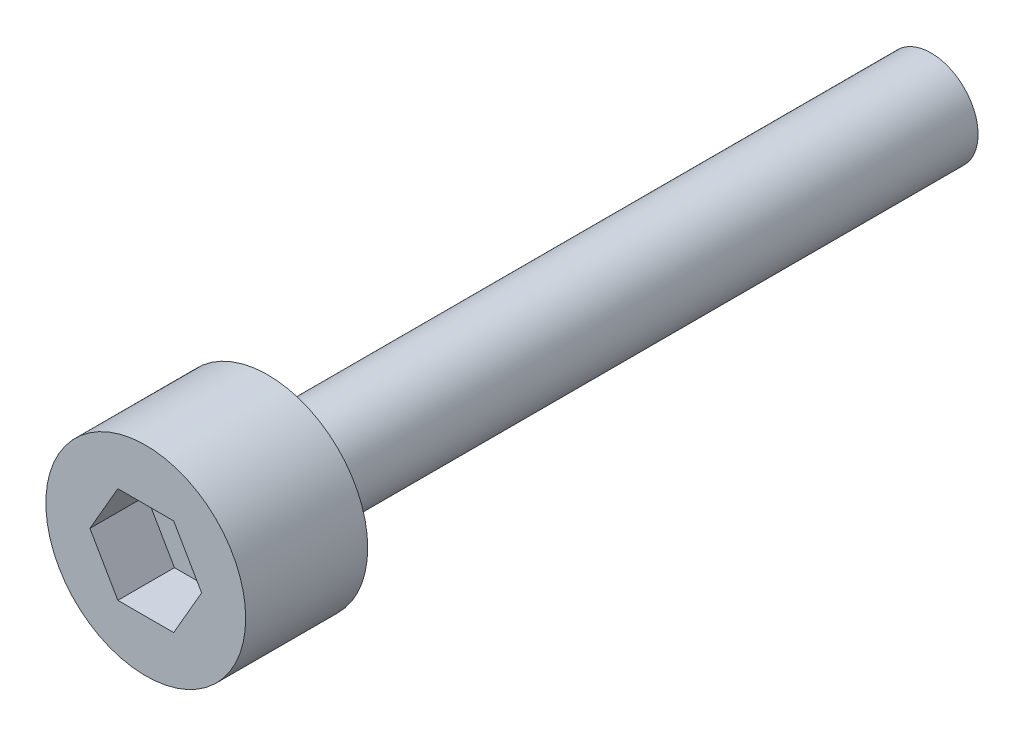
ISO-10303-21;
HEADER;
FILE_DESCRIPTION(('STEP AP214'),'2;1');
FILE_NAME('part.step','',(''),(''),'','','');
FILE_SCHEMA(('AUTOMOTIVE_DESIGN { 1 0 10303 214 1 1 1 1 }'));
ENDSEC;
DATA;
#1=APPLICATION_CONTEXT('core data for automotive mechanical design processes');
#2=APPLICATION_PROTOCOL_DEFINITION('international standard','automotive_design',2000,#1);
#3=PRODUCT_CONTEXT('',#1,'mechanical');
#4=PRODUCT('Part','Part','',(#3));
#5=PRODUCT_RELATED_PRODUCT_CATEGORY('part','',(#4));
#6=PRODUCT_DEFINITION_FORMATION('','',#4);
#7=PRODUCT_DEFINITION_CONTEXT('part definition',#1,'design');
#8=PRODUCT_DEFINITION('design','',#6,#7);
#9=PRODUCT_DEFINITION_SHAPE('','',#8);
#10=(LENGTH_UNIT() NAMED_UNIT(*) SI_UNIT(.MILLI.,.METRE.));
#11=(NAMED_UNIT(*) PLANE_ANGLE_UNIT() SI_UNIT($,.RADIAN.));
#12=(NAMED_UNIT(*) SI_UNIT($,.STERADIAN.) SOLID_ANGLE_UNIT());
#13=UNCERTAINTY_MEASURE_WITH_UNIT(LENGTH_MEASURE(1.E-05),#10,'distance_accuracy_value','');
#14=(GEOMETRIC_REPRESENTATION_CONTEXT(3) GLOBAL_UNCERTAINTY_ASSIGNED_CONTEXT((#13)) GLOBAL_UNIT_ASSIGNED_CONTEXT((#10,
#11,#12)) REPRESENTATION_CONTEXT('',''));
#15=CARTESIAN_POINT('',(0.,0.,0.));
#16=DIRECTION('',(0.,0.,1.));
#17=DIRECTION('',(1.,0.,0.));
#18=AXIS2_PLACEMENT_3D('',#15,#16,#17);
#19=CARTESIAN_POINT('',(0.,0.,3.5052));
#20=DIRECTION('',(0.,0.,-1.));
#21=DIRECTION('',(-1.,0.,0.));
#22=AXIS2_PLACEMENT_3D('',#19,#20,#21);
#23=CYLINDRICAL_SURFACE('',#22,2.8702);
#24=CARTESIAN_POINT('',(0.,0.,3.5052));
#25=DIRECTION('',(0.,0.,1.));
#26=DIRECTION('',(1.,0.,0.));
#27=AXIS2_PLACEMENT_3D('',#24,#25,#26);
#28=CIRCLE('',#27,2.8702);
#29=CARTESIAN_POINT('',(2.8702,0.,3.5052));
#30=VERTEX_POINT('',#29);
#31=EDGE_CURVE('E12',#30,#30,#28,.T.);
#32=ORIENTED_EDGE('',*,*,#31,.F.);
#33=EDGE_LOOP('',(#32));
#34=FACE_BOUND('',#33,.T.);
#35=CARTESIAN_POINT('',(0.,0.,0.));
#36=DIRECTION('',(0.,0.,1.));
#37=DIRECTION('',(1.,0.,0.));
#38=AXIS2_PLACEMENT_3D('',#35,#36,#37);
#39=CIRCLE('',#38,2.8702);
#40=CARTESIAN_POINT('',(2.8702,0.,0.));
#41=VERTEX_POINT('',#40);
#42=EDGE_CURVE('E37',#41,#41,#39,.T.);
#43=ORIENTED_EDGE('',*,*,#42,.T.);
#44=EDGE_LOOP('',(#43));
#45=FACE_BOUND('',#44,.T.);
#46=ADVANCED_FACE('F34',(#34,#45),#23,.T.);
#47=CARTESIAN_POINT('',(0.,0.,3.5052));
#48=DIRECTION('',(0.,0.,1.));
#49=DIRECTION('',(1.,0.,0.));
#50=AXIS2_PLACEMENT_3D('',#47,#48,#49);
#51=PLANE('',#50);
#52=DIRECTION('',(-0.5,0.866025403784438,0.));
#53=VECTOR('',#52,1.);
#54=CARTESIAN_POINT('',(1.60395121659243,0.,3.5052));
#55=LINE('',#54,#53);
#56=CARTESIAN_POINT('',(1.60395121659243,0.,3.5052));
#57=VERTEX_POINT('',#56);
#58=CARTESIAN_POINT('',(0.801975608296214,1.3890625,3.5052));
#59=VERTEX_POINT('',#58);
#60=EDGE_CURVE('E48',#57,#59,#55,.T.);
#61=ORIENTED_EDGE('',*,*,#60,.F.);
#62=DIRECTION('',(0.5,0.866025403784439,0.));
#63=VECTOR('',#62,1.);
#64=CARTESIAN_POINT('',(0.801975608296215,-1.3890625,3.5052));
#65=LINE('',#64,#63);
#66=CARTESIAN_POINT('',(0.801975608296215,-1.3890625,3.5052));
#67=VERTEX_POINT('',#66);
#68=EDGE_CURVE('E131',#67,#57,#65,.T.);
#69=ORIENTED_EDGE('',*,*,#68,.F.);
#70=DIRECTION('',(1.,0.,0.));
#71=VECTOR('',#70,1.);
#72=CARTESIAN_POINT('',(-0.801975608296214,-1.3890625,3.5052));
#73=LINE('',#72,#71);
#74=CARTESIAN_POINT('',(-0.801975608296214,-1.3890625,3.5052));
#75=VERTEX_POINT('',#74);
#76=EDGE_CURVE('E129',#75,#67,#73,.T.);
#77=ORIENTED_EDGE('',*,*,#76,.F.);
#78=DIRECTION('',(0.5,-0.866025403784439,0.));
#79=VECTOR('',#78,1.);
#80=CARTESIAN_POINT('',(-1.60395121659243,0.,3.5052));
#81=LINE('',#80,#79);
#82=CARTESIAN_POINT('',(-1.60395121659243,0.,3.5052));
#83=VERTEX_POINT('',#82);
#84=EDGE_CURVE('E96',#83,#75,#81,.T.);
#85=ORIENTED_EDGE('',*,*,#84,.F.);
#86=DIRECTION('',(-0.499999999999999,-0.866025403784439,0.));
#87=VECTOR('',#86,1.);
#88=CARTESIAN_POINT('',(-0.801975608296215,1.3890625,3.5052));
#89=LINE('',#88,#87);
#90=CARTESIAN_POINT('',(-0.801975608296215,1.3890625,3.5052));
#91=VERTEX_POINT('',#90);
#92=EDGE_CURVE('E125',#91,#83,#89,.T.);
#93=ORIENTED_EDGE('',*,*,#92,.F.);
#94=DIRECTION('',(-1.,0.,0.));
#95=VECTOR('',#94,1.);
#96=CARTESIAN_POINT('',(0.801975608296214,1.3890625,3.5052));
#97=LINE('',#96,#95);
#98=EDGE_CURVE('E122',#59,#91,#97,.T.);
#99=ORIENTED_EDGE('',*,*,#98,.F.);
#100=EDGE_LOOP('',(#61,#69,#77,#85,#93,#99));
#101=FACE_BOUND('',#100,.T.);
#102=ORIENTED_EDGE('',*,*,#31,.T.);
#103=EDGE_LOOP('',(#102));
#104=FACE_BOUND('',#103,.T.);
#105=ADVANCED_FACE('F160',(#101,#104),#51,.T.);
#106=CARTESIAN_POINT('',(0.,0.,0.));
#107=DIRECTION('',(0.,0.,1.));
#108=DIRECTION('',(1.,0.,0.));
#109=AXIS2_PLACEMENT_3D('',#106,#107,#108);
#110=PLANE('',#109);
#111=ORIENTED_EDGE('',*,*,#42,.F.);
#112=EDGE_LOOP('',(#111));
#113=FACE_BOUND('',#112,.T.);
#114=CARTESIAN_POINT('',(0.,0.,0.));
#115=DIRECTION('',(0.,0.,-1.));
#116=DIRECTION('',(-1.,0.,0.));
#117=AXIS2_PLACEMENT_3D('',#114,#115,#116);
#118=CIRCLE('',#117,1.35255);
#119=CARTESIAN_POINT('',(-1.35255,0.,0.));
#120=VERTEX_POINT('',#119);
#121=EDGE_CURVE('E141',#120,#120,#118,.T.);
#122=ORIENTED_EDGE('',*,*,#121,.F.);
#123=EDGE_LOOP('',(#122));
#124=FACE_BOUND('',#123,.T.);
#125=ADVANCED_FACE('F151',(#113,#124),#110,.F.);
#126=CARTESIAN_POINT('',(0.,0.,0.));
#127=DIRECTION('',(0.,0.,-1.));
#128=DIRECTION('',(-1.,0.,0.));
#129=AXIS2_PLACEMENT_3D('',#126,#127,#128);
#130=CYLINDRICAL_SURFACE('',#129,1.35255);
#131=CARTESIAN_POINT('',(0.,0.,-19.05));
#132=DIRECTION('',(0.,0.,-1.));
#133=DIRECTION('',(-1.,0.,0.));
#134=AXIS2_PLACEMENT_3D('',#131,#132,#133);
#135=CIRCLE('',#134,1.35255);
#136=CARTESIAN_POINT('',(-1.35255,0.,-19.05));
#137=VERTEX_POINT('',#136);
#138=EDGE_CURVE('E135',#137,#137,#135,.T.);
#139=CARTESIAN_POINT('',(-1.35255,0.,0.));
#140=CARTESIAN_POINT('',(-1.35255,0.,-0.1984375));
#141=CARTESIAN_POINT('',(-1.35255,0.,-0.396875));
#142=CARTESIAN_POINT('',(-1.35255,0.,-0.79375));
#143=CARTESIAN_POINT('',(-1.35255,0.,-0.9921875));
#144=CARTESIAN_POINT('',(-1.35255,0.,-1.3890625));
#145=CARTESIAN_POINT('',(-1.35255,0.,-1.5875));
#146=CARTESIAN_POINT('',(-1.35255,0.,-1.984375));
#147=CARTESIAN_POINT('',(-1.35255,0.,-2.1828125));
#148=CARTESIAN_POINT('',(-1.35255,0.,-2.5796875));
#149=CARTESIAN_POINT('',(-1.35255,0.,-2.778125));
#150=CARTESIAN_POINT('',(-1.35255,0.,-3.175));
#151=CARTESIAN_POINT('',(-1.35255,0.,-3.3734375));
#152=CARTESIAN_POINT('',(-1.35255,0.,-3.7703125));
#153=CARTESIAN_POINT('',(-1.35255,0.,-3.96875));
#154=CARTESIAN_POINT('',(-1.35255,0.,-4.365625));
#155=CARTESIAN_POINT('',(-1.35255,0.,-4.5640625));
#156=CARTESIAN_POINT('',(-1.35255,0.,-4.9609375));
#157=CARTESIAN_POINT('',(-1.35255,0.,-5.159375));
#158=CARTESIAN_POINT('',(-1.35255,0.,-5.55625));
#159=CARTESIAN_POINT('',(-1.35255,0.,-5.7546875));
#160=CARTESIAN_POINT('',(-1.35255,0.,-6.1515625));
#161=CARTESIAN_POINT('',(-1.35255,0.,-6.35));
#162=CARTESIAN_POINT('',(-1.35255,0.,-6.746875));
#163=CARTESIAN_POINT('',(-1.35255,0.,-6.9453125));
#164=CARTESIAN_POINT('',(-1.35255,0.,-7.3421875));
#165=CARTESIAN_POINT('',(-1.35255,0.,-7.540625));
#166=CARTESIAN_POINT('',(-1.35255,0.,-7.9375));
#167=CARTESIAN_POINT('',(-1.35255,0.,-8.1359375));
#168=CARTESIAN_POINT('',(-1.35255,0.,-8.5328125));
#169=CARTESIAN_POINT('',(-1.35255,0.,-8.73125));
#170=CARTESIAN_POINT('',(-1.35255,0.,-9.128125));
#171=CARTESIAN_POINT('',(-1.35255,0.,-9.3265625));
#172=CARTESIAN_POINT('',(-1.35255,0.,-9.7234375));
#173=CARTESIAN_POINT('',(-1.35255,0.,-9.921875));
#174=CARTESIAN_POINT('',(-1.35255,0.,-10.31875));
#175=CARTESIAN_POINT('',(-1.35255,0.,-10.5171875));
#176=CARTESIAN_POINT('',(-1.35255,0.,-10.9140625));
#177=CARTESIAN_POINT('',(-1.35255,0.,-11.1125));
#178=CARTESIAN_POINT('',(-1.35255,0.,-11.509375));
#179=CARTESIAN_POINT('',(-1.35255,0.,-11.7078125));
#180=CARTESIAN_POINT('',(-1.35255,0.,-12.1046875));
#181=CARTESIAN_POINT('',(-1.35255,0.,-12.303125));
#182=CARTESIAN_POINT('',(-1.35255,0.,-12.7));
#183=CARTESIAN_POINT('',(-1.35255,0.,-12.8984375));
#184=CARTESIAN_POINT('',(-1.35255,0.,-13.2953125));
#185=CARTESIAN_POINT('',(-1.35255,0.,-13.49375));
#186=CARTESIAN_POINT('',(-1.35255,0.,-13.890625));
#187=CARTESIAN_POINT('',(-1.35255,0.,-14.0890625));
#188=CARTESIAN_POINT('',(-1.35255,0.,-14.4859375));
#189=CARTESIAN_POINT('',(-1.35255,0.,-14.684375));
#190=CARTESIAN_POINT('',(-1.35255,0.,-15.08125));
#191=CARTESIAN_POINT('',(-1.35255,0.,-15.2796875));
#192=CARTESIAN_POINT('',(-1.35255,0.,-15.6765625));
#193=CARTESIAN_POINT('',(-1.35255,0.,-15.875));
#194=CARTESIAN_POINT('',(-1.35255,0.,-16.271875));
#195=CARTESIAN_POINT('',(-1.35255,0.,-16.4703125));
#196=CARTESIAN_POINT('',(-1.35255,0.,-16.8671875));
#197=CARTESIAN_POINT('',(-1.35255,0.,-17.065625));
#198=CARTESIAN_POINT('',(-1.35255,0.,-17.4625));
#199=CARTESIAN_POINT('',(-1.35255,0.,-17.6609375));
#200=CARTESIAN_POINT('',(-1.35255,0.,-18.0578125));
#201=CARTESIAN_POINT('',(-1.35255,0.,-18.25625));
#202=CARTESIAN_POINT('',(-1.35255,0.,-18.653125));
#203=CARTESIAN_POINT('',(-1.35255,0.,-18.8515625));
#204=CARTESIAN_POINT('',(-1.35255,0.,-19.05));
#205=B_SPLINE_CURVE_WITH_KNOTS('',3,(#139,#140,#141,#142,#143,#144,#145,#146,#147,#148,#149,
#150,#151,#152,#153,#154,#155,#156,#157,#158,#159,#160,#161,#162,#163,#164,#165,#166,#167,#168,
#169,#170,#171,#172,#173,#174,#175,#176,#177,#178,#179,#180,#181,#182,#183,#184,#185,#186,#187,
#188,#189,#190,#191,#192,#193,#194,#195,#196,#197,#198,#199,#200,#201,#202,#203,#204),
.UNSPECIFIED.,.F.,.F.,(4,2,2,2,2,2,2,2,2,2,2,2,2,2,2,2,2,2,2,2,2,2,2,2,2,2,2,2,2,2,2,2,4),(0.,
0.5953125,1.190625,1.7859375,2.38125,2.9765625,3.571875,4.1671875,4.7625,5.3578125,5.953125,
6.5484375,7.14375,7.7390625,8.334375,8.9296875,9.525,10.1203125,10.715625,11.3109375,11.90625,
12.5015625,13.096875,13.6921875,14.2875,14.8828125,15.478125,16.0734375,16.66875,17.2640625,
17.859375,18.4546875,19.05),.UNSPECIFIED.);
#206=EDGE_CURVE('BSEAM149',#120,#137,#205,.T.);
#207=ORIENTED_EDGE('',*,*,#121,.T.);
#208=ORIENTED_EDGE('',*,*,#138,.F.);
#209=ORIENTED_EDGE('',*,*,#206,.T.);
#210=ORIENTED_EDGE('',*,*,#206,.F.);
#211=EDGE_LOOP('',(#207,#209,#208,#210));
#212=FACE_BOUND('',#211,.T.);
#213=ADVANCED_FACE('F149',(#212),#130,.T.);
#214=CARTESIAN_POINT('',(0.,0.,-19.05));
#215=DIRECTION('',(0.,0.,-1.));
#216=DIRECTION('',(-1.,0.,0.));
#217=AXIS2_PLACEMENT_3D('',#214,#215,#216);
#218=PLANE('',#217);
#219=ORIENTED_EDGE('',*,*,#138,.T.);
#220=EDGE_LOOP('',(#219));
#221=FACE_BOUND('',#220,.T.);
#222=ADVANCED_FACE('F147',(#221),#218,.T.);
#223=CARTESIAN_POINT('',(1.60395121659243,0.,1.8796));
#224=DIRECTION('',(0.866025403784439,0.5,0.));
#225=DIRECTION('',(-0.5,0.866025403784439,0.));
#226=AXIS2_PLACEMENT_3D('',#223,#224,#225);
#227=PLANE('',#226);
#228=ORIENTED_EDGE('',*,*,#60,.T.);
#229=DIRECTION('',(0.,0.,1.));
#230=VECTOR('',#229,1.);
#231=CARTESIAN_POINT('',(0.801975608296214,1.3890625,1.8796));
#232=LINE('',#231,#230);
#233=CARTESIAN_POINT('',(0.801975608296214,1.3890625,1.8796));
#234=VERTEX_POINT('',#233);
#235=EDGE_CURVE('E78',#234,#59,#232,.T.);
#236=ORIENTED_EDGE('',*,*,#235,.F.);
#237=DIRECTION('',(-0.5,0.866025403784438,0.));
#238=VECTOR('',#237,1.);
#239=CARTESIAN_POINT('',(1.60395121659243,0.,1.8796));
#240=LINE('',#239,#238);
#241=CARTESIAN_POINT('',(1.60395121659243,0.,1.8796));
#242=VERTEX_POINT('',#241);
#243=EDGE_CURVE('E133',#242,#234,#240,.T.);
#244=ORIENTED_EDGE('',*,*,#243,.F.);
#245=DIRECTION('',(0.,0.,1.));
#246=VECTOR('',#245,1.);
#247=CARTESIAN_POINT('',(1.60395121659243,0.,1.8796));
#248=LINE('',#247,#246);
#249=EDGE_CURVE('E56',#242,#57,#248,.T.);
#250=ORIENTED_EDGE('',*,*,#249,.T.);
#251=EDGE_LOOP('',(#228,#236,#244,#250));
#252=FACE_BOUND('',#251,.T.);
#253=ADVANCED_FACE('F158',(#252),#227,.F.);
#254=CARTESIAN_POINT('',(0.801975608296215,-1.3890625,1.8796));
#255=DIRECTION('',(0.866025403784439,-0.5,0.));
#256=DIRECTION('',(0.5,0.866025403784439,0.));
#257=AXIS2_PLACEMENT_3D('',#254,#255,#256);
#258=PLANE('',#257);
#259=ORIENTED_EDGE('',*,*,#68,.T.);
#260=ORIENTED_EDGE('',*,*,#249,.F.);
#261=DIRECTION('',(0.5,0.866025403784439,0.));
#262=VECTOR('',#261,1.);
#263=CARTESIAN_POINT('',(0.801975608296215,-1.3890625,1.8796));
#264=LINE('',#263,#262);
#265=CARTESIAN_POINT('',(0.801975608296215,-1.3890625,1.8796));
#266=VERTEX_POINT('',#265);
#267=EDGE_CURVE('E108',#266,#242,#264,.T.);
#268=ORIENTED_EDGE('',*,*,#267,.F.);
#269=DIRECTION('',(0.,0.,1.));
#270=VECTOR('',#269,1.);
#271=CARTESIAN_POINT('',(0.801975608296215,-1.3890625,1.8796));
#272=LINE('',#271,#270);
#273=EDGE_CURVE('E100',#266,#67,#272,.T.);
#274=ORIENTED_EDGE('',*,*,#273,.T.);
#275=EDGE_LOOP('',(#259,#260,#268,#274));
#276=FACE_BOUND('',#275,.T.);
#277=ADVANCED_FACE('F186',(#276),#258,.F.);
#278=CARTESIAN_POINT('',(-0.801975608296214,-1.3890625,1.8796));
#279=DIRECTION('',(0.,-1.,0.));
#280=DIRECTION('',(1.,0.,0.));
#281=AXIS2_PLACEMENT_3D('',#278,#279,#280);
#282=PLANE('',#281);
#283=ORIENTED_EDGE('',*,*,#76,.T.);
#284=ORIENTED_EDGE('',*,*,#273,.F.);
#285=DIRECTION('',(1.,0.,0.));
#286=VECTOR('',#285,1.);
#287=CARTESIAN_POINT('',(-0.801975608296214,-1.3890625,1.8796));
#288=LINE('',#287,#286);
#289=CARTESIAN_POINT('',(-0.801975608296214,-1.3890625,1.8796));
#290=VERTEX_POINT('',#289);
#291=EDGE_CURVE('E104',#290,#266,#288,.T.);
#292=ORIENTED_EDGE('',*,*,#291,.F.);
#293=DIRECTION('',(0.,0.,1.));
#294=VECTOR('',#293,1.);
#295=CARTESIAN_POINT('',(-0.801975608296214,-1.3890625,1.8796));
#296=LINE('',#295,#294);
#297=EDGE_CURVE('E89',#290,#75,#296,.T.);
#298=ORIENTED_EDGE('',*,*,#297,.T.);
#299=EDGE_LOOP('',(#283,#284,#292,#298));
#300=FACE_BOUND('',#299,.T.);
#301=ADVANCED_FACE('F105',(#300),#282,.F.);
#302=CARTESIAN_POINT('',(-1.60395121659243,0.,1.8796));
#303=DIRECTION('',(-0.866025403784438,-0.5,0.));
#304=DIRECTION('',(0.5,-0.866025403784439,0.));
#305=AXIS2_PLACEMENT_3D('',#302,#303,#304);
#306=PLANE('',#305);
#307=ORIENTED_EDGE('',*,*,#84,.T.);
#308=ORIENTED_EDGE('',*,*,#297,.F.);
#309=DIRECTION('',(0.5,-0.866025403784439,0.));
#310=VECTOR('',#309,1.);
#311=CARTESIAN_POINT('',(-1.60395121659243,0.,1.8796));
#312=LINE('',#311,#310);
#313=CARTESIAN_POINT('',(-1.60395121659243,0.,1.8796));
#314=VERTEX_POINT('',#313);
#315=EDGE_CURVE('E93',#314,#290,#312,.T.);
#316=ORIENTED_EDGE('',*,*,#315,.F.);
#317=DIRECTION('',(0.,0.,1.));
#318=VECTOR('',#317,1.);
#319=CARTESIAN_POINT('',(-1.60395121659243,0.,1.8796));
#320=LINE('',#319,#318);
#321=EDGE_CURVE('E101',#314,#83,#320,.T.);
#322=ORIENTED_EDGE('',*,*,#321,.T.);
#323=EDGE_LOOP('',(#307,#308,#316,#322));
#324=FACE_BOUND('',#323,.T.);
#325=ADVANCED_FACE('F91',(#324),#306,.F.);
#326=CARTESIAN_POINT('',(-0.801975608296215,1.3890625,1.8796));
#327=DIRECTION('',(-0.866025403784439,0.499999999999999,0.));
#328=DIRECTION('',(-0.5,-0.866025403784439,0.));
#329=AXIS2_PLACEMENT_3D('',#326,#327,#328);
#330=PLANE('',#329);
#331=ORIENTED_EDGE('',*,*,#92,.T.);
#332=ORIENTED_EDGE('',*,*,#321,.F.);
#333=DIRECTION('',(-0.499999999999999,-0.866025403784439,0.));
#334=VECTOR('',#333,1.);
#335=CARTESIAN_POINT('',(-0.801975608296215,1.3890625,1.8796));
#336=LINE('',#335,#334);
#337=CARTESIAN_POINT('',(-0.801975608296215,1.3890625,1.8796));
#338=VERTEX_POINT('',#337);
#339=EDGE_CURVE('E114',#338,#314,#336,.T.);
#340=ORIENTED_EDGE('',*,*,#339,.F.);
#341=DIRECTION('',(0.,0.,1.));
#342=VECTOR('',#341,1.);
#343=CARTESIAN_POINT('',(-0.801975608296215,1.3890625,1.8796));
#344=LINE('',#343,#342);
#345=EDGE_CURVE('E138',#338,#91,#344,.T.);
#346=ORIENTED_EDGE('',*,*,#345,.T.);
#347=EDGE_LOOP('',(#331,#332,#340,#346));
#348=FACE_BOUND('',#347,.T.);
#349=ADVANCED_FACE('F194',(#348),#330,.F.);
#350=CARTESIAN_POINT('',(0.801975608296214,1.3890625,1.8796));
#351=DIRECTION('',(0.,1.,0.));
#352=DIRECTION('',(-1.,0.,0.));
#353=AXIS2_PLACEMENT_3D('',#350,#351,#352);
#354=PLANE('',#353);
#355=ORIENTED_EDGE('',*,*,#98,.T.);
#356=ORIENTED_EDGE('',*,*,#345,.F.);
#357=DIRECTION('',(-1.,0.,0.));
#358=VECTOR('',#357,1.);
#359=CARTESIAN_POINT('',(0.801975608296214,1.3890625,1.8796));
#360=LINE('',#359,#358);
#361=EDGE_CURVE('E116',#234,#338,#360,.T.);
#362=ORIENTED_EDGE('',*,*,#361,.F.);
#363=ORIENTED_EDGE('',*,*,#235,.T.);
#364=EDGE_LOOP('',(#355,#356,#362,#363));
#365=FACE_BOUND('',#364,.T.);
#366=ADVANCED_FACE('F183',(#365),#354,.F.);
#367=CARTESIAN_POINT('',(0.,0.,1.8796));
#368=DIRECTION('',(0.,0.,1.));
#369=DIRECTION('',(1.,0.,0.));
#370=AXIS2_PLACEMENT_3D('',#367,#368,#369);
#371=PLANE('',#370);
#372=ORIENTED_EDGE('',*,*,#243,.T.);
#373=ORIENTED_EDGE('',*,*,#361,.T.);
#374=ORIENTED_EDGE('',*,*,#339,.T.);
#375=ORIENTED_EDGE('',*,*,#315,.T.);
#376=ORIENTED_EDGE('',*,*,#291,.T.);
#377=ORIENTED_EDGE('',*,*,#267,.T.);
#378=EDGE_LOOP('',(#372,#373,#374,#375,#376,#377));
#379=FACE_BOUND('',#378,.T.);
#380=ADVANCED_FACE('F111',(#379),#371,.T.);
#381=CLOSED_SHELL('',(#46,#105,#125,#213,#222,#253,#277,#301,#325,#349,#366,#380));
#382=MANIFOLD_SOLID_BREP('B2',#381);
#383=ADVANCED_BREP_SHAPE_REPRESENTATION('',(#18,#382),#14);
#384=SHAPE_DEFINITION_REPRESENTATION(#9,#383);
ENDSEC;
END-ISO-10303-21;
